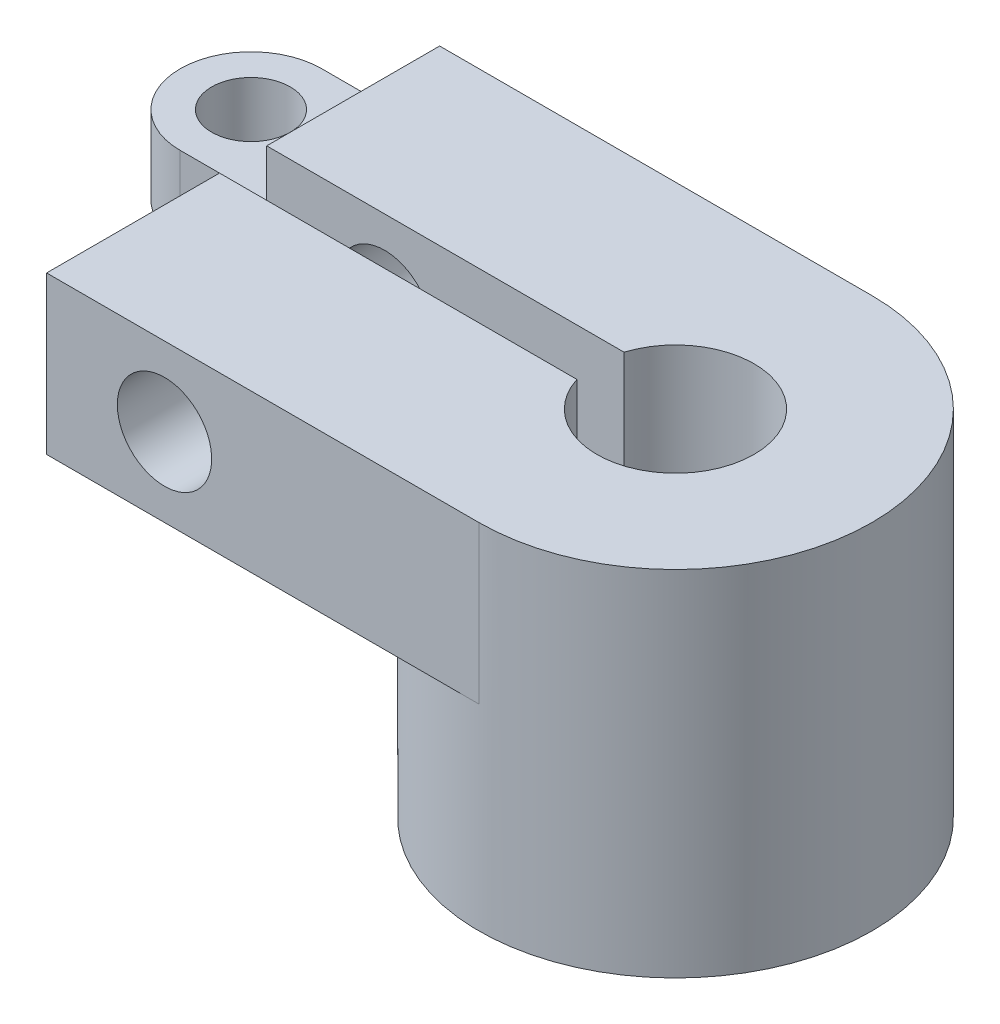
ISO-10303-21;
HEADER;
FILE_DESCRIPTION(('STEP AP214'),'2;1');
FILE_NAME('part.step','',(''),(''),'','','');
FILE_SCHEMA(('AUTOMOTIVE_DESIGN { 1 0 10303 214 1 1 1 1 }'));
ENDSEC;
DATA;
#1=APPLICATION_CONTEXT('core data for automotive mechanical design processes');
#2=APPLICATION_PROTOCOL_DEFINITION('international standard','automotive_design',2000,#1);
#3=PRODUCT_CONTEXT('',#1,'mechanical');
#4=PRODUCT('Part','Part','',(#3));
#5=PRODUCT_RELATED_PRODUCT_CATEGORY('part','',(#4));
#6=PRODUCT_DEFINITION_FORMATION('','',#4);
#7=PRODUCT_DEFINITION_CONTEXT('part definition',#1,'design');
#8=PRODUCT_DEFINITION('design','',#6,#7);
#9=PRODUCT_DEFINITION_SHAPE('','',#8);
#10=(LENGTH_UNIT() NAMED_UNIT(*) SI_UNIT(.MILLI.,.METRE.));
#11=(NAMED_UNIT(*) PLANE_ANGLE_UNIT() SI_UNIT($,.RADIAN.));
#12=(NAMED_UNIT(*) SI_UNIT($,.STERADIAN.) SOLID_ANGLE_UNIT());
#13=UNCERTAINTY_MEASURE_WITH_UNIT(LENGTH_MEASURE(1.E-05),#10,'distance_accuracy_value','');
#14=(GEOMETRIC_REPRESENTATION_CONTEXT(3) GLOBAL_UNCERTAINTY_ASSIGNED_CONTEXT((#13)) GLOBAL_UNIT_ASSIGNED_CONTEXT((#10,
#11,#12)) REPRESENTATION_CONTEXT('',''));
#15=CARTESIAN_POINT('',(0.,0.,0.));
#16=DIRECTION('',(0.,0.,1.));
#17=DIRECTION('',(1.,0.,0.));
#18=AXIS2_PLACEMENT_3D('',#15,#16,#17);
#19=CARTESIAN_POINT('',(0.,-10.,0.));
#20=DIRECTION('',(0.,1.,0.));
#21=DIRECTION('',(0.,0.,1.));
#22=AXIS2_PLACEMENT_3D('',#19,#20,#21);
#23=PLANE('',#22);
#24=DIRECTION('',(-1.,0.,0.));
#25=VECTOR('',#24,1.);
#26=CARTESIAN_POINT('',(0.,-10.,-25.));
#27=LINE('',#26,#25);
#28=CARTESIAN_POINT('',(0.,-10.,-25.));
#29=VERTEX_POINT('',#28);
#30=CARTESIAN_POINT('',(-70.,-10.,-25.));
#31=VERTEX_POINT('',#30);
#32=EDGE_CURVE('E204',#29,#31,#27,.T.);
#33=ORIENTED_EDGE('',*,*,#32,.F.);
#34=CARTESIAN_POINT('',(0.,-10.,0.));
#35=DIRECTION('',(0.,1.,0.));
#36=DIRECTION('',(0.,0.,1.));
#37=AXIS2_PLACEMENT_3D('',#34,#35,#36);
#38=CIRCLE('',#37,25.);
#39=CARTESIAN_POINT('',(-24.8193472919817,-10.,-3.));
#40=VERTEX_POINT('',#39);
#41=EDGE_CURVE('E11',#29,#40,#38,.T.);
#42=ORIENTED_EDGE('',*,*,#41,.T.);
#43=DIRECTION('',(1.,0.,0.));
#44=VECTOR('',#43,1.);
#45=CARTESIAN_POINT('',(-55.,-10.,-2.99999999999999));
#46=LINE('',#45,#44);
#47=CARTESIAN_POINT('',(-55.,-10.,-2.99999999999999));
#48=VERTEX_POINT('',#47);
#49=EDGE_CURVE('E239',#48,#40,#46,.T.);
#50=ORIENTED_EDGE('',*,*,#49,.F.);
#51=DIRECTION('',(0.,0.,1.));
#52=VECTOR('',#51,1.);
#53=CARTESIAN_POINT('',(-55.,-10.,-25.));
#54=LINE('',#53,#52);
#55=CARTESIAN_POINT('',(-55.,-10.,-7.00000000000002));
#56=VERTEX_POINT('',#55);
#57=EDGE_CURVE('E236',#56,#48,#54,.T.);
#58=ORIENTED_EDGE('',*,*,#57,.F.);
#59=DIRECTION('',(-1.,0.,0.));
#60=VECTOR('',#59,1.);
#61=CARTESIAN_POINT('',(-55.,-10.,-7.00000000000002));
#62=LINE('',#61,#60);
#63=CARTESIAN_POINT('',(-70.,-10.,-7.00000000000002));
#64=VERTEX_POINT('',#63);
#65=EDGE_CURVE('E174',#56,#64,#62,.T.);
#66=ORIENTED_EDGE('',*,*,#65,.T.);
#67=CARTESIAN_POINT('',(-70.,-10.,-16.));
#68=DIRECTION('',(0.,-1.,0.));
#69=DIRECTION('',(0.,0.,-1.));
#70=AXIS2_PLACEMENT_3D('',#67,#68,#69);
#71=CIRCLE('',#70,8.99999999999999);
#72=EDGE_CURVE('E148',#64,#31,#71,.T.);
#73=ORIENTED_EDGE('',*,*,#72,.T.);
#74=EDGE_LOOP('',(#33,#42,#50,#58,#66,#73));
#75=FACE_BOUND('',#74,.T.);
#76=CARTESIAN_POINT('',(-70.,-10.,-16.));
#77=DIRECTION('',(0.,-1.,0.));
#78=DIRECTION('',(0.,0.,-1.));
#79=AXIS2_PLACEMENT_3D('',#76,#77,#78);
#80=CIRCLE('',#79,5.);
#81=CARTESIAN_POINT('',(-70.,-10.,-21.));
#82=VERTEX_POINT('',#81);
#83=EDGE_CURVE('E379',#82,#82,#80,.T.);
#84=ORIENTED_EDGE('',*,*,#83,.F.);
#85=EDGE_LOOP('',(#84));
#86=FACE_BOUND('',#85,.T.);
#87=ADVANCED_FACE('F45',(#75,#86),#23,.F.);
#88=CARTESIAN_POINT('',(0.,10.,0.));
#89=DIRECTION('',(0.,-1.,0.));
#90=DIRECTION('',(0.,0.,-1.));
#91=AXIS2_PLACEMENT_3D('',#88,#89,#90);
#92=CYLINDRICAL_SURFACE('',#91,25.);
#93=DIRECTION('',(0.,-1.,0.));
#94=VECTOR('',#93,1.);
#95=CARTESIAN_POINT('',(0.,10.,25.));
#96=LINE('',#95,#94);
#97=CARTESIAN_POINT('',(0.,10.,25.));
#98=VERTEX_POINT('',#97);
#99=CARTESIAN_POINT('',(0.,-10.,25.));
#100=VERTEX_POINT('',#99);
#101=EDGE_CURVE('E233',#98,#100,#96,.T.);
#102=ORIENTED_EDGE('',*,*,#101,.T.);
#103=CARTESIAN_POINT('',(-24.8193472919817,-10.,3.));
#104=VERTEX_POINT('',#103);
#105=EDGE_CURVE('E49',#104,#100,#38,.T.);
#106=ORIENTED_EDGE('',*,*,#105,.F.);
#107=DIRECTION('',(0.,1.,0.));
#108=VECTOR('',#107,1.);
#109=CARTESIAN_POINT('',(-24.8193472919817,-35.,3.));
#110=LINE('',#109,#108);
#111=CARTESIAN_POINT('',(-24.8193472919817,-35.,3.));
#112=VERTEX_POINT('',#111);
#113=EDGE_CURVE('E200',#112,#104,#110,.T.);
#114=ORIENTED_EDGE('',*,*,#113,.F.);
#115=CARTESIAN_POINT('',(0.,-35.,0.));
#116=DIRECTION('',(0.,1.,0.));
#117=DIRECTION('',(0.,0.,1.));
#118=AXIS2_PLACEMENT_3D('',#115,#116,#117);
#119=CIRCLE('',#118,25.);
#120=CARTESIAN_POINT('',(-24.8193472919817,-35.,-3.));
#121=VERTEX_POINT('',#120);
#122=EDGE_CURVE('E192',#112,#121,#119,.T.);
#123=ORIENTED_EDGE('',*,*,#122,.T.);
#124=DIRECTION('',(0.,1.,0.));
#125=VECTOR('',#124,1.);
#126=CARTESIAN_POINT('',(-24.8193472919817,-35.,-3.));
#127=LINE('',#126,#125);
#128=EDGE_CURVE('E201',#121,#40,#127,.T.);
#129=ORIENTED_EDGE('',*,*,#128,.T.);
#130=ORIENTED_EDGE('',*,*,#41,.F.);
#131=DIRECTION('',(0.,-1.,0.));
#132=VECTOR('',#131,1.);
#133=CARTESIAN_POINT('',(0.,10.,-25.));
#134=LINE('',#133,#132);
#135=CARTESIAN_POINT('',(0.,10.,-25.));
#136=VERTEX_POINT('',#135);
#137=EDGE_CURVE('E274',#136,#29,#134,.T.);
#138=ORIENTED_EDGE('',*,*,#137,.F.);
#139=CARTESIAN_POINT('',(0.,10.,0.));
#140=DIRECTION('',(0.,1.,0.));
#141=DIRECTION('',(0.,0.,1.));
#142=AXIS2_PLACEMENT_3D('',#139,#140,#141);
#143=CIRCLE('',#142,25.);
#144=EDGE_CURVE('E207',#98,#136,#143,.T.);
#145=ORIENTED_EDGE('',*,*,#144,.F.);
#146=EDGE_LOOP('',(#102,#106,#114,#123,#129,#130,#138,#145));
#147=FACE_BOUND('',#146,.T.);
#148=ADVANCED_FACE('F47',(#147),#92,.T.);
#149=CARTESIAN_POINT('',(0.,10.,-25.));
#150=DIRECTION('',(0.,0.,1.));
#151=DIRECTION('',(1.,0.,0.));
#152=AXIS2_PLACEMENT_3D('',#149,#150,#151);
#153=PLANE('',#152);
#154=CARTESIAN_POINT('',(-40.,0.,-25.));
#155=DIRECTION('',(0.,0.,-1.));
#156=DIRECTION('',(-1.,0.,0.));
#157=AXIS2_PLACEMENT_3D('',#154,#155,#156);
#158=CIRCLE('',#157,6.00000000000001);
#159=CARTESIAN_POINT('',(-46.,0.,-25.));
#160=VERTEX_POINT('',#159);
#161=EDGE_CURVE('E374',#160,#160,#158,.T.);
#162=ORIENTED_EDGE('',*,*,#161,.F.);
#163=EDGE_LOOP('',(#162));
#164=FACE_BOUND('',#163,.T.);
#165=ORIENTED_EDGE('',*,*,#32,.T.);
#166=DIRECTION('',(0.,-1.,0.));
#167=VECTOR('',#166,1.);
#168=CARTESIAN_POINT('',(-70.,0.,-25.));
#169=LINE('',#168,#167);
#170=CARTESIAN_POINT('',(-70.,0.,-25.));
#171=VERTEX_POINT('',#170);
#172=EDGE_CURVE('E154',#171,#31,#169,.T.);
#173=ORIENTED_EDGE('',*,*,#172,.F.);
#174=DIRECTION('',(1.,0.,0.));
#175=VECTOR('',#174,1.);
#176=CARTESIAN_POINT('',(-55.,0.,-25.));
#177=LINE('',#176,#175);
#178=CARTESIAN_POINT('',(-55.,0.,-25.));
#179=VERTEX_POINT('',#178);
#180=EDGE_CURVE('E162',#171,#179,#177,.T.);
#181=ORIENTED_EDGE('',*,*,#180,.T.);
#182=DIRECTION('',(0.,-1.,0.));
#183=VECTOR('',#182,1.);
#184=CARTESIAN_POINT('',(-55.,10.,-25.));
#185=LINE('',#184,#183);
#186=CARTESIAN_POINT('',(-55.,10.,-25.));
#187=VERTEX_POINT('',#186);
#188=EDGE_CURVE('E66',#187,#179,#185,.T.);
#189=ORIENTED_EDGE('',*,*,#188,.F.);
#190=DIRECTION('',(-1.,0.,0.));
#191=VECTOR('',#190,1.);
#192=CARTESIAN_POINT('',(0.,10.,-25.));
#193=LINE('',#192,#191);
#194=EDGE_CURVE('E211',#136,#187,#193,.T.);
#195=ORIENTED_EDGE('',*,*,#194,.F.);
#196=ORIENTED_EDGE('',*,*,#137,.T.);
#197=EDGE_LOOP('',(#165,#173,#181,#189,#195,#196));
#198=FACE_BOUND('',#197,.T.);
#199=ADVANCED_FACE('F317',(#164,#198),#153,.F.);
#200=CARTESIAN_POINT('',(-55.,10.,-25.));
#201=DIRECTION('',(1.,0.,0.));
#202=DIRECTION('',(0.,0.,-1.));
#203=AXIS2_PLACEMENT_3D('',#200,#201,#202);
#204=PLANE('',#203);
#205=DIRECTION('',(0.,0.,1.));
#206=VECTOR('',#205,1.);
#207=CARTESIAN_POINT('',(-55.,0.,-7.00000000000002));
#208=LINE('',#207,#206);
#209=CARTESIAN_POINT('',(-55.,0.,-7.00000000000002));
#210=VERTEX_POINT('',#209);
#211=EDGE_CURVE('E61',#179,#210,#208,.T.);
#212=ORIENTED_EDGE('',*,*,#211,.T.);
#213=DIRECTION('',(0.,-1.,0.));
#214=VECTOR('',#213,1.);
#215=CARTESIAN_POINT('',(-55.,0.,-7.00000000000002));
#216=LINE('',#215,#214);
#217=EDGE_CURVE('E155',#210,#56,#216,.T.);
#218=ORIENTED_EDGE('',*,*,#217,.T.);
#219=ORIENTED_EDGE('',*,*,#57,.T.);
#220=DIRECTION('',(0.,-1.,0.));
#221=VECTOR('',#220,1.);
#222=CARTESIAN_POINT('',(-55.,10.,-2.99999999999999));
#223=LINE('',#222,#221);
#224=CARTESIAN_POINT('',(-55.,10.,-2.99999999999999));
#225=VERTEX_POINT('',#224);
#226=EDGE_CURVE('E269',#225,#48,#223,.T.);
#227=ORIENTED_EDGE('',*,*,#226,.F.);
#228=DIRECTION('',(0.,0.,1.));
#229=VECTOR('',#228,1.);
#230=CARTESIAN_POINT('',(-55.,10.,-25.));
#231=LINE('',#230,#229);
#232=EDGE_CURVE('E215',#187,#225,#231,.T.);
#233=ORIENTED_EDGE('',*,*,#232,.F.);
#234=ORIENTED_EDGE('',*,*,#188,.T.);
#235=EDGE_LOOP('',(#212,#218,#219,#227,#233,#234));
#236=FACE_BOUND('',#235,.T.);
#237=ADVANCED_FACE('F319',(#236),#204,.F.);
#238=CARTESIAN_POINT('',(-55.,10.,-2.99999999999999));
#239=DIRECTION('',(0.,0.,-1.));
#240=DIRECTION('',(-1.,0.,0.));
#241=AXIS2_PLACEMENT_3D('',#238,#239,#240);
#242=PLANE('',#241);
#243=CARTESIAN_POINT('',(-40.,0.,-2.99999999999999));
#244=DIRECTION('',(0.,0.,-1.));
#245=DIRECTION('',(-1.,0.,0.));
#246=AXIS2_PLACEMENT_3D('',#243,#244,#245);
#247=CIRCLE('',#246,6.00000000000001);
#248=CARTESIAN_POINT('',(-46.,0.,-2.99999999999999));
#249=VERTEX_POINT('',#248);
#250=EDGE_CURVE('E377',#249,#249,#247,.T.);
#251=ORIENTED_EDGE('',*,*,#250,.T.);
#252=EDGE_LOOP('',(#251));
#253=FACE_BOUND('',#252,.T.);
#254=ORIENTED_EDGE('',*,*,#49,.T.);
#255=ORIENTED_EDGE('',*,*,#128,.F.);
#256=DIRECTION('',(1.,0.,0.));
#257=VECTOR('',#256,1.);
#258=CARTESIAN_POINT('',(-24.8193472919817,-35.,-2.99999999999999));
#259=LINE('',#258,#257);
#260=CARTESIAN_POINT('',(-9.53939201416946,-35.,-2.99999999999999));
#261=VERTEX_POINT('',#260);
#262=EDGE_CURVE('E196',#121,#261,#259,.T.);
#263=ORIENTED_EDGE('',*,*,#262,.T.);
#264=DIRECTION('',(0.,-1.,0.));
#265=VECTOR('',#264,1.);
#266=CARTESIAN_POINT('',(-9.53939201416946,10.,-2.99999999999999));
#267=LINE('',#266,#265);
#268=CARTESIAN_POINT('',(-9.53939201416946,10.,-2.99999999999999));
#269=VERTEX_POINT('',#268);
#270=EDGE_CURVE('E266',#269,#261,#267,.T.);
#271=ORIENTED_EDGE('',*,*,#270,.F.);
#272=DIRECTION('',(1.,0.,0.));
#273=VECTOR('',#272,1.);
#274=CARTESIAN_POINT('',(-55.,10.,-2.99999999999999));
#275=LINE('',#274,#273);
#276=EDGE_CURVE('E218',#225,#269,#275,.T.);
#277=ORIENTED_EDGE('',*,*,#276,.F.);
#278=ORIENTED_EDGE('',*,*,#226,.T.);
#279=EDGE_LOOP('',(#254,#255,#263,#271,#277,#278));
#280=FACE_BOUND('',#279,.T.);
#281=ADVANCED_FACE('F310',(#253,#280),#242,.F.);
#282=CARTESIAN_POINT('',(0.,10.,0.));
#283=DIRECTION('',(0.,-1.,0.));
#284=DIRECTION('',(0.,0.,-1.));
#285=AXIS2_PLACEMENT_3D('',#282,#283,#284);
#286=CYLINDRICAL_SURFACE('',#285,10.);
#287=ORIENTED_EDGE('',*,*,#270,.T.);
#288=CARTESIAN_POINT('',(0.,-35.,0.));
#289=DIRECTION('',(0.,-1.,0.));
#290=DIRECTION('',(0.,0.,1.));
#291=AXIS2_PLACEMENT_3D('',#288,#289,#290);
#292=CIRCLE('',#291,10.);
#293=CARTESIAN_POINT('',(-9.53939201416946,-35.,3.));
#294=VERTEX_POINT('',#293);
#295=EDGE_CURVE('E181',#261,#294,#292,.T.);
#296=ORIENTED_EDGE('',*,*,#295,.T.);
#297=DIRECTION('',(0.,-1.,0.));
#298=VECTOR('',#297,1.);
#299=CARTESIAN_POINT('',(-9.53939201416946,10.,3.));
#300=LINE('',#299,#298);
#301=CARTESIAN_POINT('',(-9.53939201416946,10.,3.));
#302=VERTEX_POINT('',#301);
#303=EDGE_CURVE('E263',#302,#294,#300,.T.);
#304=ORIENTED_EDGE('',*,*,#303,.F.);
#305=CARTESIAN_POINT('',(0.,10.,0.));
#306=DIRECTION('',(0.,-1.,0.));
#307=DIRECTION('',(0.,0.,1.));
#308=AXIS2_PLACEMENT_3D('',#305,#306,#307);
#309=CIRCLE('',#308,10.);
#310=EDGE_CURVE('E221',#269,#302,#309,.T.);
#311=ORIENTED_EDGE('',*,*,#310,.F.);
#312=EDGE_LOOP('',(#287,#296,#304,#311));
#313=FACE_BOUND('',#312,.T.);
#314=ADVANCED_FACE('F322',(#313),#286,.F.);
#315=CARTESIAN_POINT('',(-55.,10.,3.00000000000001));
#316=DIRECTION('',(0.,0.,1.));
#317=DIRECTION('',(1.,0.,0.));
#318=AXIS2_PLACEMENT_3D('',#315,#316,#317);
#319=PLANE('',#318);
#320=CARTESIAN_POINT('',(-40.,0.,3.));
#321=DIRECTION('',(0.,0.,1.));
#322=DIRECTION('',(1.,0.,0.));
#323=AXIS2_PLACEMENT_3D('',#320,#321,#322);
#324=CIRCLE('',#323,6.00000000000001);
#325=CARTESIAN_POINT('',(-34.,0.,3.));
#326=VERTEX_POINT('',#325);
#327=EDGE_CURVE('E380',#326,#326,#324,.T.);
#328=ORIENTED_EDGE('',*,*,#327,.T.);
#329=EDGE_LOOP('',(#328));
#330=FACE_BOUND('',#329,.T.);
#331=DIRECTION('',(0.,-1.,0.));
#332=VECTOR('',#331,1.);
#333=CARTESIAN_POINT('',(-55.,10.,3.00000000000001));
#334=LINE('',#333,#332);
#335=CARTESIAN_POINT('',(-55.,10.,3.00000000000001));
#336=VERTEX_POINT('',#335);
#337=CARTESIAN_POINT('',(-55.,-10.,3.00000000000001));
#338=VERTEX_POINT('',#337);
#339=EDGE_CURVE('E259',#336,#338,#334,.T.);
#340=ORIENTED_EDGE('',*,*,#339,.F.);
#341=DIRECTION('',(-1.,0.,0.));
#342=VECTOR('',#341,1.);
#343=CARTESIAN_POINT('',(-55.,10.,3.00000000000001));
#344=LINE('',#343,#342);
#345=EDGE_CURVE('E224',#302,#336,#344,.T.);
#346=ORIENTED_EDGE('',*,*,#345,.F.);
#347=ORIENTED_EDGE('',*,*,#303,.T.);
#348=DIRECTION('',(-1.,0.,0.));
#349=VECTOR('',#348,1.);
#350=CARTESIAN_POINT('',(-9.53939201416946,-35.,3.));
#351=LINE('',#350,#349);
#352=EDGE_CURVE('E188',#294,#112,#351,.T.);
#353=ORIENTED_EDGE('',*,*,#352,.T.);
#354=ORIENTED_EDGE('',*,*,#113,.T.);
#355=DIRECTION('',(-1.,0.,0.));
#356=VECTOR('',#355,1.);
#357=CARTESIAN_POINT('',(-55.,-10.,3.00000000000001));
#358=LINE('',#357,#356);
#359=EDGE_CURVE('E243',#104,#338,#358,.T.);
#360=ORIENTED_EDGE('',*,*,#359,.T.);
#361=EDGE_LOOP('',(#340,#346,#347,#353,#354,#360));
#362=FACE_BOUND('',#361,.T.);
#363=ADVANCED_FACE('F301',(#330,#362),#319,.F.);
#364=CARTESIAN_POINT('',(-55.,10.,25.));
#365=DIRECTION('',(1.,0.,0.));
#366=DIRECTION('',(0.,0.,-1.));
#367=AXIS2_PLACEMENT_3D('',#364,#365,#366);
#368=PLANE('',#367);
#369=DIRECTION('',(0.,0.,1.));
#370=VECTOR('',#369,1.);
#371=CARTESIAN_POINT('',(-55.,-10.,25.));
#372=LINE('',#371,#370);
#373=CARTESIAN_POINT('',(-55.,-10.,25.));
#374=VERTEX_POINT('',#373);
#375=EDGE_CURVE('E246',#338,#374,#372,.T.);
#376=ORIENTED_EDGE('',*,*,#375,.T.);
#377=DIRECTION('',(0.,-1.,0.));
#378=VECTOR('',#377,1.);
#379=CARTESIAN_POINT('',(-55.,10.,25.));
#380=LINE('',#379,#378);
#381=CARTESIAN_POINT('',(-55.,10.,25.));
#382=VERTEX_POINT('',#381);
#383=EDGE_CURVE('E255',#382,#374,#380,.T.);
#384=ORIENTED_EDGE('',*,*,#383,.F.);
#385=DIRECTION('',(0.,0.,1.));
#386=VECTOR('',#385,1.);
#387=CARTESIAN_POINT('',(-55.,10.,25.));
#388=LINE('',#387,#386);
#389=EDGE_CURVE('E227',#336,#382,#388,.T.);
#390=ORIENTED_EDGE('',*,*,#389,.F.);
#391=ORIENTED_EDGE('',*,*,#339,.T.);
#392=EDGE_LOOP('',(#376,#384,#390,#391));
#393=FACE_BOUND('',#392,.T.);
#394=ADVANCED_FACE('F299',(#393),#368,.F.);
#395=CARTESIAN_POINT('',(0.,10.,25.));
#396=DIRECTION('',(0.,0.,-1.));
#397=DIRECTION('',(-1.,0.,0.));
#398=AXIS2_PLACEMENT_3D('',#395,#396,#397);
#399=PLANE('',#398);
#400=CARTESIAN_POINT('',(-40.,0.,25.));
#401=DIRECTION('',(0.,0.,-1.));
#402=DIRECTION('',(-1.,0.,0.));
#403=AXIS2_PLACEMENT_3D('',#400,#401,#402);
#404=CIRCLE('',#403,6.00000000000001);
#405=CARTESIAN_POINT('',(-46.,0.,25.));
#406=VERTEX_POINT('',#405);
#407=EDGE_CURVE('E386',#406,#406,#404,.T.);
#408=ORIENTED_EDGE('',*,*,#407,.T.);
#409=EDGE_LOOP('',(#408));
#410=FACE_BOUND('',#409,.T.);
#411=DIRECTION('',(1.,0.,0.));
#412=VECTOR('',#411,1.);
#413=CARTESIAN_POINT('',(0.,-10.,25.));
#414=LINE('',#413,#412);
#415=EDGE_CURVE('E212',#374,#100,#414,.T.);
#416=ORIENTED_EDGE('',*,*,#415,.T.);
#417=ORIENTED_EDGE('',*,*,#101,.F.);
#418=DIRECTION('',(1.,0.,0.));
#419=VECTOR('',#418,1.);
#420=CARTESIAN_POINT('',(0.,10.,25.));
#421=LINE('',#420,#419);
#422=EDGE_CURVE('E230',#382,#98,#421,.T.);
#423=ORIENTED_EDGE('',*,*,#422,.F.);
#424=ORIENTED_EDGE('',*,*,#383,.T.);
#425=EDGE_LOOP('',(#416,#417,#423,#424));
#426=FACE_BOUND('',#425,.T.);
#427=ADVANCED_FACE('F289',(#410,#426),#399,.F.);
#428=CARTESIAN_POINT('',(0.,10.,0.));
#429=DIRECTION('',(0.,1.,0.));
#430=DIRECTION('',(0.,0.,1.));
#431=AXIS2_PLACEMENT_3D('',#428,#429,#430);
#432=PLANE('',#431);
#433=ORIENTED_EDGE('',*,*,#422,.T.);
#434=ORIENTED_EDGE('',*,*,#144,.T.);
#435=ORIENTED_EDGE('',*,*,#194,.T.);
#436=ORIENTED_EDGE('',*,*,#232,.T.);
#437=ORIENTED_EDGE('',*,*,#276,.T.);
#438=ORIENTED_EDGE('',*,*,#310,.T.);
#439=ORIENTED_EDGE('',*,*,#345,.T.);
#440=ORIENTED_EDGE('',*,*,#389,.T.);
#441=EDGE_LOOP('',(#433,#434,#435,#436,#437,#438,#439,#440));
#442=FACE_BOUND('',#441,.T.);
#443=ADVANCED_FACE('F294',(#442),#432,.T.);
#444=ORIENTED_EDGE('',*,*,#359,.F.);
#445=ORIENTED_EDGE('',*,*,#105,.T.);
#446=ORIENTED_EDGE('',*,*,#415,.F.);
#447=ORIENTED_EDGE('',*,*,#375,.F.);
#448=EDGE_LOOP('',(#444,#445,#446,#447));
#449=FACE_BOUND('',#448,.T.);
#450=ADVANCED_FACE('F284',(#449),#23,.F.);
#451=CARTESIAN_POINT('',(0.,-35.,0.));
#452=DIRECTION('',(0.,1.,0.));
#453=DIRECTION('',(0.,0.,1.));
#454=AXIS2_PLACEMENT_3D('',#451,#452,#453);
#455=PLANE('',#454);
#456=ORIENTED_EDGE('',*,*,#295,.F.);
#457=ORIENTED_EDGE('',*,*,#262,.F.);
#458=ORIENTED_EDGE('',*,*,#122,.F.);
#459=ORIENTED_EDGE('',*,*,#352,.F.);
#460=EDGE_LOOP('',(#456,#457,#458,#459));
#461=FACE_BOUND('',#460,.T.);
#462=ADVANCED_FACE('F307',(#461),#455,.F.);
#463=CARTESIAN_POINT('',(-70.,0.,-16.));
#464=DIRECTION('',(0.,-1.,0.));
#465=DIRECTION('',(0.,0.,-1.));
#466=AXIS2_PLACEMENT_3D('',#463,#464,#465);
#467=CYLINDRICAL_SURFACE('',#466,8.99999999999999);
#468=ORIENTED_EDGE('',*,*,#72,.F.);
#469=DIRECTION('',(0.,-1.,0.));
#470=VECTOR('',#469,1.);
#471=CARTESIAN_POINT('',(-70.,0.,-7.00000000000002));
#472=LINE('',#471,#470);
#473=CARTESIAN_POINT('',(-70.,0.,-7.00000000000002));
#474=VERTEX_POINT('',#473);
#475=EDGE_CURVE('E141',#474,#64,#472,.T.);
#476=ORIENTED_EDGE('',*,*,#475,.F.);
#477=CARTESIAN_POINT('',(-70.,0.,-16.));
#478=DIRECTION('',(0.,-1.,0.));
#479=DIRECTION('',(0.,0.,-1.));
#480=AXIS2_PLACEMENT_3D('',#477,#478,#479);
#481=CIRCLE('',#480,8.99999999999999);
#482=EDGE_CURVE('E145',#474,#171,#481,.T.);
#483=ORIENTED_EDGE('',*,*,#482,.T.);
#484=ORIENTED_EDGE('',*,*,#172,.T.);
#485=EDGE_LOOP('',(#468,#476,#483,#484));
#486=FACE_BOUND('',#485,.T.);
#487=ADVANCED_FACE('F143',(#486),#467,.T.);
#488=CARTESIAN_POINT('',(-55.,0.,-7.00000000000002));
#489=DIRECTION('',(0.,0.,1.));
#490=DIRECTION('',(1.,0.,0.));
#491=AXIS2_PLACEMENT_3D('',#488,#489,#490);
#492=PLANE('',#491);
#493=ORIENTED_EDGE('',*,*,#65,.F.);
#494=ORIENTED_EDGE('',*,*,#217,.F.);
#495=DIRECTION('',(-1.,0.,0.));
#496=VECTOR('',#495,1.);
#497=CARTESIAN_POINT('',(-55.,0.,-7.00000000000002));
#498=LINE('',#497,#496);
#499=EDGE_CURVE('E160',#210,#474,#498,.T.);
#500=ORIENTED_EDGE('',*,*,#499,.T.);
#501=ORIENTED_EDGE('',*,*,#475,.T.);
#502=EDGE_LOOP('',(#493,#494,#500,#501));
#503=FACE_BOUND('',#502,.T.);
#504=ADVANCED_FACE('F165',(#503),#492,.T.);
#505=CARTESIAN_POINT('',(-70.,0.,-16.));
#506=DIRECTION('',(0.,-1.,0.));
#507=DIRECTION('',(0.,0.,-1.));
#508=AXIS2_PLACEMENT_3D('',#505,#506,#507);
#509=PLANE('',#508);
#510=CARTESIAN_POINT('',(-70.,0.,-16.));
#511=DIRECTION('',(0.,-1.,0.));
#512=DIRECTION('',(0.,0.,-1.));
#513=AXIS2_PLACEMENT_3D('',#510,#511,#512);
#514=CIRCLE('',#513,5.);
#515=CARTESIAN_POINT('',(-70.,0.,-21.));
#516=VERTEX_POINT('',#515);
#517=EDGE_CURVE('E177',#516,#516,#514,.T.);
#518=ORIENTED_EDGE('',*,*,#517,.T.);
#519=EDGE_LOOP('',(#518));
#520=FACE_BOUND('',#519,.T.);
#521=ORIENTED_EDGE('',*,*,#211,.F.);
#522=ORIENTED_EDGE('',*,*,#180,.F.);
#523=ORIENTED_EDGE('',*,*,#482,.F.);
#524=ORIENTED_EDGE('',*,*,#499,.F.);
#525=EDGE_LOOP('',(#521,#522,#523,#524));
#526=FACE_BOUND('',#525,.T.);
#527=ADVANCED_FACE('F159',(#520,#526),#509,.F.);
#528=CARTESIAN_POINT('',(-70.,0.,-16.));
#529=DIRECTION('',(0.,-1.,0.));
#530=DIRECTION('',(0.,0.,-1.));
#531=AXIS2_PLACEMENT_3D('',#528,#529,#530);
#532=CYLINDRICAL_SURFACE('',#531,5.);
#533=ORIENTED_EDGE('',*,*,#517,.F.);
#534=EDGE_LOOP('',(#533));
#535=FACE_BOUND('',#534,.T.);
#536=ORIENTED_EDGE('',*,*,#83,.T.);
#537=EDGE_LOOP('',(#536));
#538=FACE_BOUND('',#537,.T.);
#539=ADVANCED_FACE('F358',(#535,#538),#532,.F.);
#540=CARTESIAN_POINT('',(-40.,0.,-25.));
#541=DIRECTION('',(0.,0.,-1.));
#542=DIRECTION('',(-1.,0.,0.));
#543=AXIS2_PLACEMENT_3D('',#540,#541,#542);
#544=CYLINDRICAL_SURFACE('',#543,6.00000000000001);
#545=ORIENTED_EDGE('',*,*,#407,.F.);
#546=EDGE_LOOP('',(#545));
#547=FACE_BOUND('',#546,.T.);
#548=ORIENTED_EDGE('',*,*,#327,.F.);
#549=EDGE_LOOP('',(#548));
#550=FACE_BOUND('',#549,.T.);
#551=ADVANCED_FACE('F362',(#547,#550),#544,.F.);
#552=ORIENTED_EDGE('',*,*,#161,.T.);
#553=EDGE_LOOP('',(#552));
#554=FACE_BOUND('',#553,.T.);
#555=ORIENTED_EDGE('',*,*,#250,.F.);
#556=EDGE_LOOP('',(#555));
#557=FACE_BOUND('',#556,.T.);
#558=ADVANCED_FACE('F364',(#554,#557),#544,.F.);
#559=CLOSED_SHELL('',(#87,#148,#199,#237,#281,#314,#363,#394,#427,#443,#450,#462,#487,#504,#527,
#539,#551,#558));
#560=MANIFOLD_SOLID_BREP('B2',#559);
#561=ADVANCED_BREP_SHAPE_REPRESENTATION('',(#18,#560),#14);
#562=SHAPE_DEFINITION_REPRESENTATION(#9,#561);
ENDSEC;
END-ISO-10303-21;
